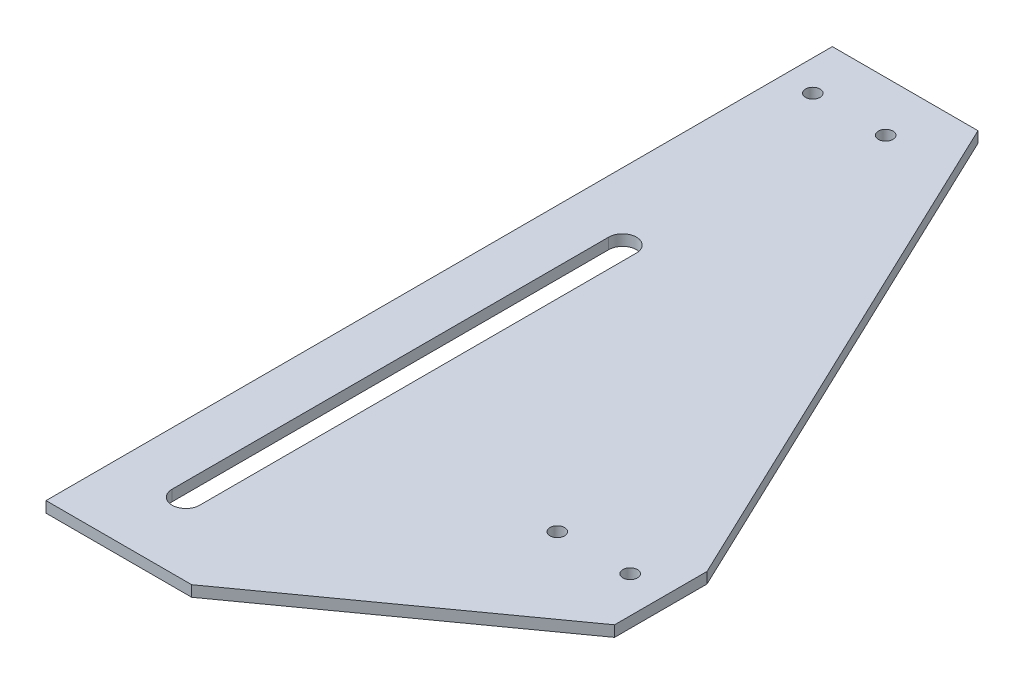
ISO-10303-21;
HEADER;
FILE_DESCRIPTION(('STEP AP214'),'2;1');
FILE_NAME('part.step','',(''),(''),'','','');
FILE_SCHEMA(('AUTOMOTIVE_DESIGN { 1 0 10303 214 1 1 1 1 }'));
ENDSEC;
DATA;
#1=APPLICATION_CONTEXT('core data for automotive mechanical design processes');
#2=APPLICATION_PROTOCOL_DEFINITION('international standard','automotive_design',2000,#1);
#3=PRODUCT_CONTEXT('',#1,'mechanical');
#4=PRODUCT('Part','Part','',(#3));
#5=PRODUCT_RELATED_PRODUCT_CATEGORY('part','',(#4));
#6=PRODUCT_DEFINITION_FORMATION('','',#4);
#7=PRODUCT_DEFINITION_CONTEXT('part definition',#1,'design');
#8=PRODUCT_DEFINITION('design','',#6,#7);
#9=PRODUCT_DEFINITION_SHAPE('','',#8);
#10=(LENGTH_UNIT() NAMED_UNIT(*) SI_UNIT(.MILLI.,.METRE.));
#11=(NAMED_UNIT(*) PLANE_ANGLE_UNIT() SI_UNIT($,.RADIAN.));
#12=(NAMED_UNIT(*) SI_UNIT($,.STERADIAN.) SOLID_ANGLE_UNIT());
#13=UNCERTAINTY_MEASURE_WITH_UNIT(LENGTH_MEASURE(1.E-05),#10,'distance_accuracy_value','');
#14=(GEOMETRIC_REPRESENTATION_CONTEXT(3) GLOBAL_UNCERTAINTY_ASSIGNED_CONTEXT((#13)) GLOBAL_UNIT_ASSIGNED_CONTEXT((#10,
#11,#12)) REPRESENTATION_CONTEXT('',''));
#15=CARTESIAN_POINT('',(0.,0.,0.));
#16=DIRECTION('',(0.,0.,1.));
#17=DIRECTION('',(1.,0.,0.));
#18=AXIS2_PLACEMENT_3D('',#15,#16,#17);
#19=CARTESIAN_POINT('',(-44.6000000000009,1.5,14.259482439642));
#20=DIRECTION('',(0.,-1.,0.));
#21=DIRECTION('',(0.,0.,-1.));
#22=AXIS2_PLACEMENT_3D('',#19,#20,#21);
#23=CYLINDRICAL_SURFACE('',#22,1.90000000000057);
#24=CARTESIAN_POINT('',(-44.6000000000009,0.,14.259482439642));
#25=DIRECTION('',(0.,1.,0.));
#26=DIRECTION('',(0.,0.,1.));
#27=AXIS2_PLACEMENT_3D('',#24,#25,#26);
#28=CIRCLE('',#27,1.90000000000057);
#29=CARTESIAN_POINT('',(-46.5000000000014,0.,14.259482439642));
#30=VERTEX_POINT('',#29);
#31=CARTESIAN_POINT('',(-42.7000000000003,0.,14.259482439642));
#32=VERTEX_POINT('',#31);
#33=EDGE_CURVE('E174',#30,#32,#28,.T.);
#34=ORIENTED_EDGE('',*,*,#33,.F.);
#35=DIRECTION('',(0.,-1.,0.));
#36=VECTOR('',#35,1.);
#37=CARTESIAN_POINT('',(-46.5000000000014,1.5,14.259482439642));
#38=LINE('',#37,#36);
#39=CARTESIAN_POINT('',(-46.5000000000014,1.5,14.259482439642));
#40=VERTEX_POINT('',#39);
#41=EDGE_CURVE('E11',#40,#30,#38,.T.);
#42=ORIENTED_EDGE('',*,*,#41,.F.);
#43=CARTESIAN_POINT('',(-44.6000000000009,1.5,14.259482439642));
#44=DIRECTION('',(0.,1.,0.));
#45=DIRECTION('',(0.,0.,1.));
#46=AXIS2_PLACEMENT_3D('',#43,#44,#45);
#47=CIRCLE('',#46,1.90000000000057);
#48=CARTESIAN_POINT('',(-42.7000000000003,1.5,14.259482439642));
#49=VERTEX_POINT('',#48);
#50=EDGE_CURVE('E129',#40,#49,#47,.T.);
#51=ORIENTED_EDGE('',*,*,#50,.T.);
#52=DIRECTION('',(0.,-1.,0.));
#53=VECTOR('',#52,1.);
#54=CARTESIAN_POINT('',(-42.7000000000003,1.5,14.259482439642));
#55=LINE('',#54,#53);
#56=EDGE_CURVE('E55',#49,#32,#55,.T.);
#57=ORIENTED_EDGE('',*,*,#56,.T.);
#58=EDGE_LOOP('',(#34,#42,#51,#57));
#59=FACE_BOUND('',#58,.T.);
#60=ADVANCED_FACE('F36',(#59),#23,.F.);
#61=CARTESIAN_POINT('',(-46.5000000000014,1.5,0.));
#62=DIRECTION('',(-1.,0.,0.));
#63=DIRECTION('',(0.,0.,1.));
#64=AXIS2_PLACEMENT_3D('',#61,#62,#63);
#65=PLANE('',#64);
#66=DIRECTION('',(0.,0.,-1.));
#67=VECTOR('',#66,1.);
#68=CARTESIAN_POINT('',(-46.5000000000014,0.,0.));
#69=LINE('',#68,#67);
#70=CARTESIAN_POINT('',(-46.5000000000015,0.,-45.7008493632649));
#71=VERTEX_POINT('',#70);
#72=EDGE_CURVE('E135',#30,#71,#69,.T.);
#73=ORIENTED_EDGE('',*,*,#72,.T.);
#74=DIRECTION('',(0.,-1.,0.));
#75=VECTOR('',#74,1.);
#76=CARTESIAN_POINT('',(-46.5000000000015,1.5,-45.7008493632649));
#77=LINE('',#76,#75);
#78=CARTESIAN_POINT('',(-46.5000000000015,1.5,-45.7008493632649));
#79=VERTEX_POINT('',#78);
#80=EDGE_CURVE('E46',#79,#71,#77,.T.);
#81=ORIENTED_EDGE('',*,*,#80,.F.);
#82=DIRECTION('',(0.,0.,-1.));
#83=VECTOR('',#82,1.);
#84=CARTESIAN_POINT('',(-46.5000000000014,1.5,0.));
#85=LINE('',#84,#83);
#86=EDGE_CURVE('E122',#40,#79,#85,.T.);
#87=ORIENTED_EDGE('',*,*,#86,.F.);
#88=ORIENTED_EDGE('',*,*,#41,.T.);
#89=EDGE_LOOP('',(#73,#81,#87,#88));
#90=FACE_BOUND('',#89,.T.);
#91=ADVANCED_FACE('F133',(#90),#65,.F.);
#92=CARTESIAN_POINT('',(-44.6000000000009,1.5,-45.7008493632649));
#93=DIRECTION('',(0.,-1.,0.));
#94=DIRECTION('',(0.,0.,-1.));
#95=AXIS2_PLACEMENT_3D('',#92,#93,#94);
#96=CYLINDRICAL_SURFACE('',#95,1.90000000000059);
#97=CARTESIAN_POINT('',(-44.6000000000009,0.,-45.7008493632649));
#98=DIRECTION('',(0.,1.,0.));
#99=DIRECTION('',(0.,0.,1.));
#100=AXIS2_PLACEMENT_3D('',#97,#98,#99);
#101=CIRCLE('',#100,1.90000000000059);
#102=CARTESIAN_POINT('',(-42.7000000000003,0.,-45.7008493632649));
#103=VERTEX_POINT('',#102);
#104=EDGE_CURVE('E177',#103,#71,#101,.T.);
#105=ORIENTED_EDGE('',*,*,#104,.F.);
#106=DIRECTION('',(0.,-1.,0.));
#107=VECTOR('',#106,1.);
#108=CARTESIAN_POINT('',(-42.7000000000003,1.5,-45.7008493632649));
#109=LINE('',#108,#107);
#110=CARTESIAN_POINT('',(-42.7000000000003,1.5,-45.7008493632649));
#111=VERTEX_POINT('',#110);
#112=EDGE_CURVE('E86',#111,#103,#109,.T.);
#113=ORIENTED_EDGE('',*,*,#112,.F.);
#114=CARTESIAN_POINT('',(-44.6000000000009,1.5,-45.7008493632649));
#115=DIRECTION('',(0.,1.,0.));
#116=DIRECTION('',(0.,0.,1.));
#117=AXIS2_PLACEMENT_3D('',#114,#115,#116);
#118=CIRCLE('',#117,1.90000000000059);
#119=EDGE_CURVE('E128',#111,#79,#118,.T.);
#120=ORIENTED_EDGE('',*,*,#119,.T.);
#121=ORIENTED_EDGE('',*,*,#80,.T.);
#122=EDGE_LOOP('',(#105,#113,#120,#121));
#123=FACE_BOUND('',#122,.T.);
#124=ADVANCED_FACE('F139',(#123),#96,.F.);
#125=CARTESIAN_POINT('',(-53.8005553933457,1.5,0.));
#126=DIRECTION('',(1.,0.,0.));
#127=DIRECTION('',(0.,0.,-1.));
#128=AXIS2_PLACEMENT_3D('',#125,#126,#127);
#129=PLANE('',#128);
#130=DIRECTION('',(0.,0.,1.));
#131=VECTOR('',#130,1.);
#132=CARTESIAN_POINT('',(-53.8005553933457,0.,0.));
#133=LINE('',#132,#131);
#134=CARTESIAN_POINT('',(-53.8005553933457,0.,-83.7008493632649));
#135=VERTEX_POINT('',#134);
#136=CARTESIAN_POINT('',(-53.8005553933457,0.,24.259482439642));
#137=VERTEX_POINT('',#136);
#138=EDGE_CURVE('E158',#135,#137,#133,.T.);
#139=ORIENTED_EDGE('',*,*,#138,.T.);
#140=DIRECTION('',(0.,-1.,0.));
#141=VECTOR('',#140,1.);
#142=CARTESIAN_POINT('',(-53.8005553933457,1.5,24.259482439642));
#143=LINE('',#142,#141);
#144=CARTESIAN_POINT('',(-53.8005553933457,1.5,24.259482439642));
#145=VERTEX_POINT('',#144);
#146=EDGE_CURVE('E40',#145,#137,#143,.T.);
#147=ORIENTED_EDGE('',*,*,#146,.F.);
#148=DIRECTION('',(0.,0.,1.));
#149=VECTOR('',#148,1.);
#150=CARTESIAN_POINT('',(-53.8005553933457,1.5,0.));
#151=LINE('',#150,#149);
#152=CARTESIAN_POINT('',(-53.8005553933457,1.5,-83.7008493632649));
#153=VERTEX_POINT('',#152);
#154=EDGE_CURVE('E194',#153,#145,#151,.T.);
#155=ORIENTED_EDGE('',*,*,#154,.F.);
#156=DIRECTION('',(0.,-1.,0.));
#157=VECTOR('',#156,1.);
#158=CARTESIAN_POINT('',(-53.8005553933457,1.5,-83.7008493632649));
#159=LINE('',#158,#157);
#160=EDGE_CURVE('E157',#153,#135,#159,.T.);
#161=ORIENTED_EDGE('',*,*,#160,.T.);
#162=EDGE_LOOP('',(#139,#147,#155,#161));
#163=FACE_BOUND('',#162,.T.);
#164=ADVANCED_FACE('F38',(#163),#129,.F.);
#165=CARTESIAN_POINT('',(0.,1.5,24.259482439642));
#166=DIRECTION('',(0.,0.,-1.));
#167=DIRECTION('',(-1.,0.,0.));
#168=AXIS2_PLACEMENT_3D('',#165,#166,#167);
#169=PLANE('',#168);
#170=DIRECTION('',(1.,0.,0.));
#171=VECTOR('',#170,1.);
#172=CARTESIAN_POINT('',(0.,0.,24.259482439642));
#173=LINE('',#172,#171);
#174=CARTESIAN_POINT('',(-33.8005553933453,0.,24.259482439642));
#175=VERTEX_POINT('',#174);
#176=EDGE_CURVE('E161',#137,#175,#173,.T.);
#177=ORIENTED_EDGE('',*,*,#176,.T.);
#178=DIRECTION('',(0.,-1.,0.));
#179=VECTOR('',#178,1.);
#180=CARTESIAN_POINT('',(-33.8005553933453,1.5,24.259482439642));
#181=LINE('',#180,#179);
#182=CARTESIAN_POINT('',(-33.8005553933453,1.5,24.259482439642));
#183=VERTEX_POINT('',#182);
#184=EDGE_CURVE('E204',#183,#175,#181,.T.);
#185=ORIENTED_EDGE('',*,*,#184,.F.);
#186=DIRECTION('',(1.,0.,0.));
#187=VECTOR('',#186,1.);
#188=CARTESIAN_POINT('',(0.,1.5,24.259482439642));
#189=LINE('',#188,#187);
#190=EDGE_CURVE('E99',#145,#183,#189,.T.);
#191=ORIENTED_EDGE('',*,*,#190,.F.);
#192=ORIENTED_EDGE('',*,*,#146,.T.);
#193=EDGE_LOOP('',(#177,#185,#191,#192));
#194=FACE_BOUND('',#193,.T.);
#195=ADVANCED_FACE('F210',(#194),#169,.F.);
#196=CARTESIAN_POINT('',(0.,1.5,0.));
#197=DIRECTION('',(-0.583086508962433,0.,-0.812410070756144));
#198=DIRECTION('',(-0.812410070756144,0.,0.583086508962433));
#199=AXIS2_PLACEMENT_3D('',#196,#197,#198);
#200=PLANE('',#199);
#201=DIRECTION('',(0.812410070756144,0.,-0.583086508962433));
#202=VECTOR('',#201,1.);
#203=CARTESIAN_POINT('',(0.,0.,0.));
#204=LINE('',#203,#202);
#205=CARTESIAN_POINT('',(0.,0.,0.));
#206=VERTEX_POINT('',#205);
#207=EDGE_CURVE('E163',#175,#206,#204,.T.);
#208=ORIENTED_EDGE('',*,*,#207,.T.);
#209=DIRECTION('',(0.,-1.,0.));
#210=VECTOR('',#209,1.);
#211=CARTESIAN_POINT('',(0.,1.5,0.));
#212=LINE('',#211,#210);
#213=CARTESIAN_POINT('',(0.,1.5,0.));
#214=VERTEX_POINT('',#213);
#215=EDGE_CURVE('E203',#214,#206,#212,.T.);
#216=ORIENTED_EDGE('',*,*,#215,.F.);
#217=DIRECTION('',(0.812410070756144,0.,-0.583086508962433));
#218=VECTOR('',#217,1.);
#219=CARTESIAN_POINT('',(0.,1.5,0.));
#220=LINE('',#219,#218);
#221=EDGE_CURVE('E224',#183,#214,#220,.T.);
#222=ORIENTED_EDGE('',*,*,#221,.F.);
#223=ORIENTED_EDGE('',*,*,#184,.T.);
#224=EDGE_LOOP('',(#208,#216,#222,#223));
#225=FACE_BOUND('',#224,.T.);
#226=ADVANCED_FACE('F222',(#225),#200,.F.);
#227=CARTESIAN_POINT('',(0.,1.5,0.));
#228=DIRECTION('',(1.,0.,0.));
#229=DIRECTION('',(0.,0.,-1.));
#230=AXIS2_PLACEMENT_3D('',#227,#228,#229);
#231=PLANE('',#230);
#232=DIRECTION('',(0.,0.,1.));
#233=VECTOR('',#232,1.);
#234=CARTESIAN_POINT('',(0.,0.,0.));
#235=LINE('',#234,#233);
#236=CARTESIAN_POINT('',(0.,0.,-12.7));
#237=VERTEX_POINT('',#236);
#238=EDGE_CURVE('E166',#237,#206,#235,.T.);
#239=ORIENTED_EDGE('',*,*,#238,.F.);
#240=DIRECTION('',(0.,-1.,0.));
#241=VECTOR('',#240,1.);
#242=CARTESIAN_POINT('',(0.,1.5,-12.7));
#243=LINE('',#242,#241);
#244=CARTESIAN_POINT('',(0.,1.5,-12.7));
#245=VERTEX_POINT('',#244);
#246=EDGE_CURVE('E201',#245,#237,#243,.T.);
#247=ORIENTED_EDGE('',*,*,#246,.F.);
#248=DIRECTION('',(0.,0.,1.));
#249=VECTOR('',#248,1.);
#250=CARTESIAN_POINT('',(0.,1.5,0.));
#251=LINE('',#250,#249);
#252=EDGE_CURVE('E227',#245,#214,#251,.T.);
#253=ORIENTED_EDGE('',*,*,#252,.T.);
#254=ORIENTED_EDGE('',*,*,#215,.T.);
#255=EDGE_LOOP('',(#239,#247,#253,#254));
#256=FACE_BOUND('',#255,.T.);
#257=ADVANCED_FACE('F228',(#256),#231,.T.);
#258=CARTESIAN_POINT('',(4.92889813290947,1.5,-2.34644368149995));
#259=DIRECTION('',(0.90290678090266,0.,-0.429836416558666));
#260=DIRECTION('',(-0.429836416558666,0.,-0.902906780902661));
#261=AXIS2_PLACEMENT_3D('',#258,#259,#260);
#262=PLANE('',#261);
#263=DIRECTION('',(0.429836416558666,0.,0.902906780902661));
#264=VECTOR('',#263,1.);
#265=CARTESIAN_POINT('',(4.92889813290947,0.,-2.34644368149995));
#266=LINE('',#265,#264);
#267=CARTESIAN_POINT('',(-33.8005553933453,0.,-83.7008493632649));
#268=VERTEX_POINT('',#267);
#269=EDGE_CURVE('E169',#268,#237,#266,.T.);
#270=ORIENTED_EDGE('',*,*,#269,.F.);
#271=DIRECTION('',(0.,-1.,0.));
#272=VECTOR('',#271,1.);
#273=CARTESIAN_POINT('',(-33.8005553933453,1.5,-83.7008493632649));
#274=LINE('',#273,#272);
#275=CARTESIAN_POINT('',(-33.8005553933453,1.5,-83.7008493632649));
#276=VERTEX_POINT('',#275);
#277=EDGE_CURVE('E199',#276,#268,#274,.T.);
#278=ORIENTED_EDGE('',*,*,#277,.F.);
#279=DIRECTION('',(0.429836416558666,0.,0.902906780902661));
#280=VECTOR('',#279,1.);
#281=CARTESIAN_POINT('',(4.92889813290947,1.5,-2.34644368149995));
#282=LINE('',#281,#280);
#283=EDGE_CURVE('E232',#276,#245,#282,.T.);
#284=ORIENTED_EDGE('',*,*,#283,.T.);
#285=ORIENTED_EDGE('',*,*,#246,.T.);
#286=EDGE_LOOP('',(#270,#278,#284,#285));
#287=FACE_BOUND('',#286,.T.);
#288=ADVANCED_FACE('F262',(#287),#262,.T.);
#289=CARTESIAN_POINT('',(-49.6000000000018,1.5,-76.8199999999909));
#290=DIRECTION('',(0.,-1.,0.));
#291=DIRECTION('',(0.,0.,-1.));
#292=AXIS2_PLACEMENT_3D('',#289,#290,#291);
#293=CYLINDRICAL_SURFACE('',#292,1.00000000000005);
#294=CARTESIAN_POINT('',(-49.6000000000018,1.5,-76.8199999999909));
#295=DIRECTION('',(0.,1.,0.));
#296=DIRECTION('',(0.,0.,1.));
#297=AXIS2_PLACEMENT_3D('',#294,#295,#296);
#298=CIRCLE('',#297,1.00000000000005);
#299=CARTESIAN_POINT('',(-49.6000000000018,1.5,-75.8199999999909));
#300=VERTEX_POINT('',#299);
#301=EDGE_CURVE('E151',#300,#300,#298,.T.);
#302=ORIENTED_EDGE('',*,*,#301,.T.);
#303=EDGE_LOOP('',(#302));
#304=FACE_BOUND('',#303,.T.);
#305=CARTESIAN_POINT('',(-49.6000000000018,0.,-76.8199999999909));
#306=DIRECTION('',(0.,1.,0.));
#307=DIRECTION('',(0.,0.,1.));
#308=AXIS2_PLACEMENT_3D('',#305,#306,#307);
#309=CIRCLE('',#308,1.00000000000005);
#310=CARTESIAN_POINT('',(-49.6000000000018,0.,-75.8199999999909));
#311=VERTEX_POINT('',#310);
#312=EDGE_CURVE('E188',#311,#311,#309,.T.);
#313=ORIENTED_EDGE('',*,*,#312,.F.);
#314=EDGE_LOOP('',(#313));
#315=FACE_BOUND('',#314,.T.);
#316=ADVANCED_FACE('F265',(#304,#315),#293,.F.);
#317=CARTESIAN_POINT('',(-5.,1.5,-7.14000000000004));
#318=DIRECTION('',(0.,-1.,0.));
#319=DIRECTION('',(0.,0.,-1.));
#320=AXIS2_PLACEMENT_3D('',#317,#318,#319);
#321=CYLINDRICAL_SURFACE('',#320,0.999999999999998);
#322=CARTESIAN_POINT('',(-5.,1.5,-7.14000000000004));
#323=DIRECTION('',(0.,1.,0.));
#324=DIRECTION('',(0.,0.,1.));
#325=AXIS2_PLACEMENT_3D('',#322,#323,#324);
#326=CIRCLE('',#325,0.999999999999998);
#327=CARTESIAN_POINT('',(-5.,1.5,-6.14000000000004));
#328=VERTEX_POINT('',#327);
#329=EDGE_CURVE('E148',#328,#328,#326,.T.);
#330=ORIENTED_EDGE('',*,*,#329,.T.);
#331=EDGE_LOOP('',(#330));
#332=FACE_BOUND('',#331,.T.);
#333=CARTESIAN_POINT('',(-5.,0.,-7.14000000000004));
#334=DIRECTION('',(0.,1.,0.));
#335=DIRECTION('',(0.,0.,1.));
#336=AXIS2_PLACEMENT_3D('',#333,#334,#335);
#337=CIRCLE('',#336,0.999999999999998);
#338=CARTESIAN_POINT('',(-5.,0.,-6.14000000000004));
#339=VERTEX_POINT('',#338);
#340=EDGE_CURVE('E185',#339,#339,#337,.T.);
#341=ORIENTED_EDGE('',*,*,#340,.F.);
#342=EDGE_LOOP('',(#341));
#343=FACE_BOUND('',#342,.T.);
#344=ADVANCED_FACE('F251',(#332,#343),#321,.F.);
#345=CARTESIAN_POINT('',(-15.,1.5,-7.14000000000004));
#346=DIRECTION('',(0.,-1.,0.));
#347=DIRECTION('',(0.,0.,-1.));
#348=AXIS2_PLACEMENT_3D('',#345,#346,#347);
#349=CYLINDRICAL_SURFACE('',#348,0.999999999999998);
#350=CARTESIAN_POINT('',(-15.,1.5,-7.14000000000004));
#351=DIRECTION('',(0.,1.,0.));
#352=DIRECTION('',(0.,0.,1.));
#353=AXIS2_PLACEMENT_3D('',#350,#351,#352);
#354=CIRCLE('',#353,0.999999999999998);
#355=CARTESIAN_POINT('',(-15.,1.5,-6.14000000000004));
#356=VERTEX_POINT('',#355);
#357=EDGE_CURVE('E142',#356,#356,#354,.T.);
#358=ORIENTED_EDGE('',*,*,#357,.T.);
#359=EDGE_LOOP('',(#358));
#360=FACE_BOUND('',#359,.T.);
#361=CARTESIAN_POINT('',(-15.,0.,-7.14000000000004));
#362=DIRECTION('',(0.,1.,0.));
#363=DIRECTION('',(0.,0.,1.));
#364=AXIS2_PLACEMENT_3D('',#361,#362,#363);
#365=CIRCLE('',#364,0.999999999999998);
#366=CARTESIAN_POINT('',(-15.,0.,-6.14000000000004));
#367=VERTEX_POINT('',#366);
#368=EDGE_CURVE('E182',#367,#367,#365,.T.);
#369=ORIENTED_EDGE('',*,*,#368,.F.);
#370=EDGE_LOOP('',(#369));
#371=FACE_BOUND('',#370,.T.);
#372=ADVANCED_FACE('F242',(#360,#371),#349,.F.);
#373=CARTESIAN_POINT('',(-42.7000000000003,1.5,0.));
#374=DIRECTION('',(-1.,0.,0.));
#375=DIRECTION('',(0.,0.,1.));
#376=AXIS2_PLACEMENT_3D('',#373,#374,#375);
#377=PLANE('',#376);
#378=DIRECTION('',(0.,0.,-1.));
#379=VECTOR('',#378,1.);
#380=CARTESIAN_POINT('',(-42.7000000000003,0.,0.));
#381=LINE('',#380,#379);
#382=EDGE_CURVE('E179',#32,#103,#381,.T.);
#383=ORIENTED_EDGE('',*,*,#382,.F.);
#384=ORIENTED_EDGE('',*,*,#56,.F.);
#385=DIRECTION('',(0.,0.,-1.));
#386=VECTOR('',#385,1.);
#387=CARTESIAN_POINT('',(-42.7000000000003,1.5,0.));
#388=LINE('',#387,#386);
#389=EDGE_CURVE('E140',#49,#111,#388,.T.);
#390=ORIENTED_EDGE('',*,*,#389,.T.);
#391=ORIENTED_EDGE('',*,*,#112,.T.);
#392=EDGE_LOOP('',(#383,#384,#390,#391));
#393=FACE_BOUND('',#392,.T.);
#394=ADVANCED_FACE('F239',(#393),#377,.T.);
#395=CARTESIAN_POINT('',(0.,1.5,-83.7008493632649));
#396=DIRECTION('',(0.,0.,1.));
#397=DIRECTION('',(1.,0.,0.));
#398=AXIS2_PLACEMENT_3D('',#395,#396,#397);
#399=PLANE('',#398);
#400=DIRECTION('',(-1.,0.,0.));
#401=VECTOR('',#400,1.);
#402=CARTESIAN_POINT('',(0.,0.,-83.7008493632649));
#403=LINE('',#402,#401);
#404=EDGE_CURVE('E172',#268,#135,#403,.T.);
#405=ORIENTED_EDGE('',*,*,#404,.T.);
#406=ORIENTED_EDGE('',*,*,#160,.F.);
#407=DIRECTION('',(-1.,0.,0.));
#408=VECTOR('',#407,1.);
#409=CARTESIAN_POINT('',(0.,1.5,-83.7008493632649));
#410=LINE('',#409,#408);
#411=EDGE_CURVE('E234',#276,#153,#410,.T.);
#412=ORIENTED_EDGE('',*,*,#411,.F.);
#413=ORIENTED_EDGE('',*,*,#277,.T.);
#414=EDGE_LOOP('',(#405,#406,#412,#413));
#415=FACE_BOUND('',#414,.T.);
#416=ADVANCED_FACE('F241',(#415),#399,.F.);
#417=CARTESIAN_POINT('',(-39.6000000000017,1.5,-76.8199999999909));
#418=DIRECTION('',(0.,-1.,0.));
#419=DIRECTION('',(0.,0.,-1.));
#420=AXIS2_PLACEMENT_3D('',#417,#418,#419);
#421=CYLINDRICAL_SURFACE('',#420,1.00000000000005);
#422=CARTESIAN_POINT('',(-39.6000000000017,1.5,-76.8199999999909));
#423=DIRECTION('',(0.,1.,0.));
#424=DIRECTION('',(0.,0.,1.));
#425=AXIS2_PLACEMENT_3D('',#422,#423,#424);
#426=CIRCLE('',#425,1.00000000000005);
#427=CARTESIAN_POINT('',(-39.6000000000017,1.5,-75.8199999999909));
#428=VERTEX_POINT('',#427);
#429=EDGE_CURVE('E154',#428,#428,#426,.T.);
#430=ORIENTED_EDGE('',*,*,#429,.T.);
#431=EDGE_LOOP('',(#430));
#432=FACE_BOUND('',#431,.T.);
#433=CARTESIAN_POINT('',(-39.6000000000017,0.,-76.8199999999909));
#434=DIRECTION('',(0.,1.,0.));
#435=DIRECTION('',(0.,0.,1.));
#436=AXIS2_PLACEMENT_3D('',#433,#434,#435);
#437=CIRCLE('',#436,1.00000000000005);
#438=CARTESIAN_POINT('',(-39.6000000000017,0.,-75.8199999999909));
#439=VERTEX_POINT('',#438);
#440=EDGE_CURVE('E191',#439,#439,#437,.T.);
#441=ORIENTED_EDGE('',*,*,#440,.F.);
#442=EDGE_LOOP('',(#441));
#443=FACE_BOUND('',#442,.T.);
#444=ADVANCED_FACE('F248',(#432,#443),#421,.F.);
#445=CARTESIAN_POINT('',(0.,1.5,0.));
#446=DIRECTION('',(0.,1.,0.));
#447=DIRECTION('',(0.,0.,1.));
#448=AXIS2_PLACEMENT_3D('',#445,#446,#447);
#449=PLANE('',#448);
#450=ORIENTED_EDGE('',*,*,#154,.T.);
#451=ORIENTED_EDGE('',*,*,#190,.T.);
#452=ORIENTED_EDGE('',*,*,#221,.T.);
#453=ORIENTED_EDGE('',*,*,#252,.F.);
#454=ORIENTED_EDGE('',*,*,#283,.F.);
#455=ORIENTED_EDGE('',*,*,#411,.T.);
#456=EDGE_LOOP('',(#450,#451,#452,#453,#454,#455));
#457=FACE_BOUND('',#456,.T.);
#458=ORIENTED_EDGE('',*,*,#50,.F.);
#459=ORIENTED_EDGE('',*,*,#86,.T.);
#460=ORIENTED_EDGE('',*,*,#119,.F.);
#461=ORIENTED_EDGE('',*,*,#389,.F.);
#462=EDGE_LOOP('',(#458,#459,#460,#461));
#463=FACE_BOUND('',#462,.T.);
#464=ORIENTED_EDGE('',*,*,#357,.F.);
#465=EDGE_LOOP('',(#464));
#466=FACE_BOUND('',#465,.T.);
#467=ORIENTED_EDGE('',*,*,#329,.F.);
#468=EDGE_LOOP('',(#467));
#469=FACE_BOUND('',#468,.T.);
#470=ORIENTED_EDGE('',*,*,#301,.F.);
#471=EDGE_LOOP('',(#470));
#472=FACE_BOUND('',#471,.T.);
#473=ORIENTED_EDGE('',*,*,#429,.F.);
#474=EDGE_LOOP('',(#473));
#475=FACE_BOUND('',#474,.T.);
#476=ADVANCED_FACE('F124',(#457,#463,#466,#469,#472,#475),#449,.T.);
#477=CARTESIAN_POINT('',(0.,0.,0.));
#478=DIRECTION('',(0.,1.,0.));
#479=DIRECTION('',(0.,0.,1.));
#480=AXIS2_PLACEMENT_3D('',#477,#478,#479);
#481=PLANE('',#480);
#482=ORIENTED_EDGE('',*,*,#138,.F.);
#483=ORIENTED_EDGE('',*,*,#404,.F.);
#484=ORIENTED_EDGE('',*,*,#269,.T.);
#485=ORIENTED_EDGE('',*,*,#238,.T.);
#486=ORIENTED_EDGE('',*,*,#207,.F.);
#487=ORIENTED_EDGE('',*,*,#176,.F.);
#488=EDGE_LOOP('',(#482,#483,#484,#485,#486,#487));
#489=FACE_BOUND('',#488,.T.);
#490=ORIENTED_EDGE('',*,*,#33,.T.);
#491=ORIENTED_EDGE('',*,*,#382,.T.);
#492=ORIENTED_EDGE('',*,*,#104,.T.);
#493=ORIENTED_EDGE('',*,*,#72,.F.);
#494=EDGE_LOOP('',(#490,#491,#492,#493));
#495=FACE_BOUND('',#494,.T.);
#496=ORIENTED_EDGE('',*,*,#368,.T.);
#497=EDGE_LOOP('',(#496));
#498=FACE_BOUND('',#497,.T.);
#499=ORIENTED_EDGE('',*,*,#340,.T.);
#500=EDGE_LOOP('',(#499));
#501=FACE_BOUND('',#500,.T.);
#502=ORIENTED_EDGE('',*,*,#312,.T.);
#503=EDGE_LOOP('',(#502));
#504=FACE_BOUND('',#503,.T.);
#505=ORIENTED_EDGE('',*,*,#440,.T.);
#506=EDGE_LOOP('',(#505));
#507=FACE_BOUND('',#506,.T.);
#508=ADVANCED_FACE('F217',(#489,#495,#498,#501,#504,#507),#481,.F.);
#509=CLOSED_SHELL('',(#60,#91,#124,#164,#195,#226,#257,#288,#316,#344,#372,#394,#416,#444,#476,#508));
#510=MANIFOLD_SOLID_BREP('B2',#509);
#511=ADVANCED_BREP_SHAPE_REPRESENTATION('',(#18,#510),#14);
#512=SHAPE_DEFINITION_REPRESENTATION(#9,#511);
ENDSEC;
END-ISO-10303-21;
